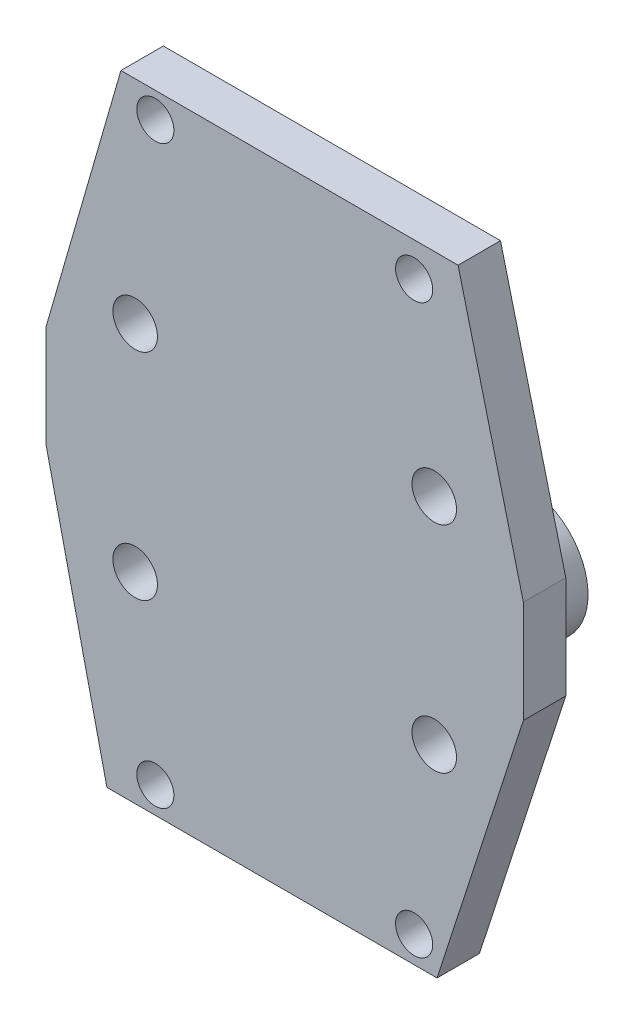
ISO-10303-21;
HEADER;
FILE_DESCRIPTION(('STEP AP214'),'2;1');
FILE_NAME('part.step','',(''),(''),'','','');
FILE_SCHEMA(('AUTOMOTIVE_DESIGN { 1 0 10303 214 1 1 1 1 }'));
ENDSEC;
DATA;
#1=APPLICATION_CONTEXT('core data for automotive mechanical design processes');
#2=APPLICATION_PROTOCOL_DEFINITION('international standard','automotive_design',2000,#1);
#3=PRODUCT_CONTEXT('',#1,'mechanical');
#4=PRODUCT('Part','Part','',(#3));
#5=PRODUCT_RELATED_PRODUCT_CATEGORY('part','',(#4));
#6=PRODUCT_DEFINITION_FORMATION('','',#4);
#7=PRODUCT_DEFINITION_CONTEXT('part definition',#1,'design');
#8=PRODUCT_DEFINITION('design','',#6,#7);
#9=PRODUCT_DEFINITION_SHAPE('','',#8);
#10=(LENGTH_UNIT() NAMED_UNIT(*) SI_UNIT(.MILLI.,.METRE.));
#11=(NAMED_UNIT(*) PLANE_ANGLE_UNIT() SI_UNIT($,.RADIAN.));
#12=(NAMED_UNIT(*) SI_UNIT($,.STERADIAN.) SOLID_ANGLE_UNIT());
#13=UNCERTAINTY_MEASURE_WITH_UNIT(LENGTH_MEASURE(1.E-05),#10,'distance_accuracy_value','');
#14=(GEOMETRIC_REPRESENTATION_CONTEXT(3) GLOBAL_UNCERTAINTY_ASSIGNED_CONTEXT((#13)) GLOBAL_UNIT_ASSIGNED_CONTEXT((#10,
#11,#12)) REPRESENTATION_CONTEXT('',''));
#15=CARTESIAN_POINT('',(0.,0.,0.));
#16=DIRECTION('',(0.,0.,1.));
#17=DIRECTION('',(1.,0.,0.));
#18=AXIS2_PLACEMENT_3D('',#15,#16,#17);
#19=CARTESIAN_POINT('',(0.,0.,0.));
#20=DIRECTION('',(0.,0.,-1.));
#21=DIRECTION('',(-1.,0.,0.));
#22=AXIS2_PLACEMENT_3D('',#19,#20,#21);
#23=PLANE('',#22);
#24=CARTESIAN_POINT('',(25.0999999999999,16.9252777339742,0.));
#25=DIRECTION('',(0.,0.,-1.));
#26=DIRECTION('',(-1.,0.,0.));
#27=AXIS2_PLACEMENT_3D('',#24,#25,#26);
#28=CIRCLE('',#27,2.1);
#29=CARTESIAN_POINT('',(22.9999999999999,16.9252777339742,0.));
#30=VERTEX_POINT('',#29);
#31=EDGE_CURVE('E290',#30,#30,#28,.T.);
#32=ORIENTED_EDGE('',*,*,#31,.F.);
#33=EDGE_LOOP('',(#32));
#34=FACE_BOUND('',#33,.T.);
#35=CARTESIAN_POINT('',(-3.1,37.1947892741322,0.));
#36=DIRECTION('',(0.,0.,-1.));
#37=DIRECTION('',(-1.,0.,0.));
#38=AXIS2_PLACEMENT_3D('',#35,#36,#37);
#39=CIRCLE('',#38,2.1);
#40=CARTESIAN_POINT('',(-5.2,37.1947892741322,0.));
#41=VERTEX_POINT('',#40);
#42=EDGE_CURVE('E294',#41,#41,#39,.T.);
#43=ORIENTED_EDGE('',*,*,#42,.F.);
#44=EDGE_LOOP('',(#43));
#45=FACE_BOUND('',#44,.T.);
#46=CARTESIAN_POINT('',(-3.10000000000006,16.9252777339742,0.));
#47=DIRECTION('',(0.,0.,-1.));
#48=DIRECTION('',(-1.,0.,0.));
#49=AXIS2_PLACEMENT_3D('',#46,#47,#48);
#50=CIRCLE('',#49,2.1);
#51=CARTESIAN_POINT('',(-5.20000000000006,16.9252777339742,0.));
#52=VERTEX_POINT('',#51);
#53=EDGE_CURVE('E298',#52,#52,#50,.T.);
#54=ORIENTED_EDGE('',*,*,#53,.F.);
#55=EDGE_LOOP('',(#54));
#56=FACE_BOUND('',#55,.T.);
#57=CARTESIAN_POINT('',(25.1,37.1947892741322,0.));
#58=DIRECTION('',(0.,0.,-1.));
#59=DIRECTION('',(-1.,0.,0.));
#60=AXIS2_PLACEMENT_3D('',#57,#58,#59);
#61=CIRCLE('',#60,2.1);
#62=CARTESIAN_POINT('',(23.,37.1947892741322,0.));
#63=VERTEX_POINT('',#62);
#64=EDGE_CURVE('E257',#63,#63,#61,.T.);
#65=ORIENTED_EDGE('',*,*,#64,.F.);
#66=EDGE_LOOP('',(#65));
#67=FACE_BOUND('',#66,.T.);
#68=DIRECTION('',(-0.277274916597774,-0.960790622677853,0.));
#69=VECTOR('',#68,1.);
#70=CARTESIAN_POINT('',(-4.44566090426302,57.2,0.));
#71=LINE('',#70,#69);
#72=CARTESIAN_POINT('',(-4.44566090426302,57.2,0.));
#73=VERTEX_POINT('',#72);
#74=CARTESIAN_POINT('',(-11.5,32.7558745250444,0.));
#75=VERTEX_POINT('',#74);
#76=EDGE_CURVE('E172',#73,#75,#71,.T.);
#77=ORIENTED_EDGE('',*,*,#76,.F.);
#78=DIRECTION('',(-1.,0.,0.));
#79=VECTOR('',#78,1.);
#80=CARTESIAN_POINT('',(4.95,57.2,0.));
#81=LINE('',#80,#79);
#82=CARTESIAN_POINT('',(27.3454525684021,57.2,0.));
#83=VERTEX_POINT('',#82);
#84=EDGE_CURVE('E241',#83,#73,#81,.T.);
#85=ORIENTED_EDGE('',*,*,#84,.F.);
#86=DIRECTION('',(-0.244160082212127,0.969734940204883,0.));
#87=VECTOR('',#86,1.);
#88=CARTESIAN_POINT('',(27.3454525684021,57.2,0.));
#89=LINE('',#88,#87);
#90=CARTESIAN_POINT('',(33.5,32.7558745250443,0.));
#91=VERTEX_POINT('',#90);
#92=EDGE_CURVE('E177',#91,#83,#89,.T.);
#93=ORIENTED_EDGE('',*,*,#92,.F.);
#94=DIRECTION('',(0.,1.,0.));
#95=VECTOR('',#94,1.);
#96=CARTESIAN_POINT('',(33.5,-2.,0.));
#97=LINE('',#96,#95);
#98=CARTESIAN_POINT('',(33.5,23.0946790021825,0.));
#99=VERTEX_POINT('',#98);
#100=EDGE_CURVE('E220',#99,#91,#97,.T.);
#101=ORIENTED_EDGE('',*,*,#100,.F.);
#102=DIRECTION('',(0.308419509687572,0.95125044338706,0.));
#103=VECTOR('',#102,1.);
#104=CARTESIAN_POINT('',(25.3636688714048,-2.,0.));
#105=LINE('',#104,#103);
#106=CARTESIAN_POINT('',(25.3636688714048,-2.,0.));
#107=VERTEX_POINT('',#106);
#108=EDGE_CURVE('E171',#107,#99,#105,.T.);
#109=ORIENTED_EDGE('',*,*,#108,.F.);
#110=DIRECTION('',(1.,0.,0.));
#111=VECTOR('',#110,1.);
#112=CARTESIAN_POINT('',(17.05,-2.,0.));
#113=LINE('',#112,#111);
#114=CARTESIAN_POINT('',(-5.76685003559456,-2.,0.));
#115=VERTEX_POINT('',#114);
#116=EDGE_CURVE('E235',#115,#107,#113,.T.);
#117=ORIENTED_EDGE('',*,*,#116,.F.);
#118=DIRECTION('',(0.222722287733107,-0.974881932618987,0.));
#119=VECTOR('',#118,1.);
#120=CARTESIAN_POINT('',(-11.5,23.0946790021825,0.));
#121=LINE('',#120,#119);
#122=CARTESIAN_POINT('',(-11.5,23.0946790021825,0.));
#123=VERTEX_POINT('',#122);
#124=EDGE_CURVE('E166',#123,#115,#121,.T.);
#125=ORIENTED_EDGE('',*,*,#124,.F.);
#126=DIRECTION('',(0.,-1.,0.));
#127=VECTOR('',#126,1.);
#128=CARTESIAN_POINT('',(-11.5,57.2,0.));
#129=LINE('',#128,#127);
#130=EDGE_CURVE('E226',#75,#123,#129,.T.);
#131=ORIENTED_EDGE('',*,*,#130,.F.);
#132=EDGE_LOOP('',(#77,#85,#93,#101,#109,#117,#125,#131));
#133=FACE_BOUND('',#132,.T.);
#134=CARTESIAN_POINT('',(23.2,0.5,0.));
#135=DIRECTION('',(0.,0.,-1.));
#136=DIRECTION('',(-1.,0.,0.));
#137=AXIS2_PLACEMENT_3D('',#134,#135,#136);
#138=CIRCLE('',#137,1.75);
#139=CARTESIAN_POINT('',(21.45,0.5,0.));
#140=VERTEX_POINT('',#139);
#141=EDGE_CURVE('E196',#140,#140,#138,.T.);
#142=ORIENTED_EDGE('',*,*,#141,.F.);
#143=EDGE_LOOP('',(#142));
#144=FACE_BOUND('',#143,.T.);
#145=CARTESIAN_POINT('',(-1.2,0.5,0.));
#146=DIRECTION('',(0.,0.,-1.));
#147=DIRECTION('',(-1.,0.,0.));
#148=AXIS2_PLACEMENT_3D('',#145,#146,#147);
#149=CIRCLE('',#148,1.75);
#150=CARTESIAN_POINT('',(-2.95,0.5,0.));
#151=VERTEX_POINT('',#150);
#152=EDGE_CURVE('E201',#151,#151,#149,.T.);
#153=ORIENTED_EDGE('',*,*,#152,.F.);
#154=EDGE_LOOP('',(#153));
#155=FACE_BOUND('',#154,.T.);
#156=CARTESIAN_POINT('',(-1.2,54.8,0.));
#157=DIRECTION('',(0.,0.,-1.));
#158=DIRECTION('',(-1.,0.,0.));
#159=AXIS2_PLACEMENT_3D('',#156,#157,#158);
#160=CIRCLE('',#159,1.75);
#161=CARTESIAN_POINT('',(-2.95,54.8,0.));
#162=VERTEX_POINT('',#161);
#163=EDGE_CURVE('E197',#162,#162,#160,.T.);
#164=ORIENTED_EDGE('',*,*,#163,.F.);
#165=EDGE_LOOP('',(#164));
#166=FACE_BOUND('',#165,.T.);
#167=CARTESIAN_POINT('',(23.2,54.,0.));
#168=DIRECTION('',(0.,0.,-1.));
#169=DIRECTION('',(-1.,0.,0.));
#170=AXIS2_PLACEMENT_3D('',#167,#168,#169);
#171=CIRCLE('',#170,1.75);
#172=CARTESIAN_POINT('',(21.45,54.,0.));
#173=VERTEX_POINT('',#172);
#174=EDGE_CURVE('E200',#173,#173,#171,.T.);
#175=ORIENTED_EDGE('',*,*,#174,.F.);
#176=EDGE_LOOP('',(#175));
#177=FACE_BOUND('',#176,.T.);
#178=DIRECTION('',(0.,1.,0.));
#179=VECTOR('',#178,1.);
#180=CARTESIAN_POINT('',(21.25,32.5271785443993,0.));
#181=LINE('',#180,#179);
#182=CARTESIAN_POINT('',(21.25,23.3233749828276,0.));
#183=VERTEX_POINT('',#182);
#184=CARTESIAN_POINT('',(21.25,32.5271785443993,0.));
#185=VERTEX_POINT('',#184);
#186=EDGE_CURVE('E162',#183,#185,#181,.T.);
#187=ORIENTED_EDGE('',*,*,#186,.F.);
#188=CARTESIAN_POINT('',(25.1,27.9252767636134,0.));
#189=DIRECTION('',(0.,0.,-1.));
#190=DIRECTION('',(-1.,0.,0.));
#191=AXIS2_PLACEMENT_3D('',#188,#189,#190);
#192=CIRCLE('',#191,6.);
#193=EDGE_CURVE('E160',#185,#183,#192,.T.);
#194=ORIENTED_EDGE('',*,*,#193,.F.);
#195=EDGE_LOOP('',(#187,#194));
#196=FACE_BOUND('',#195,.T.);
#197=DIRECTION('',(0.,-1.,0.));
#198=VECTOR('',#197,1.);
#199=CARTESIAN_POINT('',(1.11298793807284,23.653189143532,0.));
#200=LINE('',#199,#198);
#201=CARTESIAN_POINT('',(1.11298793807284,32.1973643836948,0.));
#202=VERTEX_POINT('',#201);
#203=CARTESIAN_POINT('',(1.11298793807284,23.653189143532,0.));
#204=VERTEX_POINT('',#203);
#205=EDGE_CURVE('E318',#202,#204,#200,.T.);
#206=ORIENTED_EDGE('',*,*,#205,.F.);
#207=CARTESIAN_POINT('',(-3.1,27.9252767636134,0.));
#208=DIRECTION('',(0.,0.,-1.));
#209=DIRECTION('',(-1.,0.,0.));
#210=AXIS2_PLACEMENT_3D('',#207,#208,#209);
#211=CIRCLE('',#210,6.);
#212=EDGE_CURVE('E63',#204,#202,#211,.T.);
#213=ORIENTED_EDGE('',*,*,#212,.F.);
#214=EDGE_LOOP('',(#206,#213));
#215=FACE_BOUND('',#214,.T.);
#216=ADVANCED_FACE('F41',(#34,#45,#56,#67,#133,#144,#155,#166,#177,#196,#215),#23,.T.);
#217=CARTESIAN_POINT('',(0.,0.,4.));
#218=DIRECTION('',(0.,0.,-1.));
#219=DIRECTION('',(-1.,0.,0.));
#220=AXIS2_PLACEMENT_3D('',#217,#218,#219);
#221=PLANE('',#220);
#222=CARTESIAN_POINT('',(25.0999999999999,16.9252777339742,4.));
#223=DIRECTION('',(0.,0.,-1.));
#224=DIRECTION('',(-1.,0.,0.));
#225=AXIS2_PLACEMENT_3D('',#222,#223,#224);
#226=CIRCLE('',#225,2.1);
#227=CARTESIAN_POINT('',(22.9999999999999,16.9252777339742,4.));
#228=VERTEX_POINT('',#227);
#229=EDGE_CURVE('E44',#228,#228,#226,.T.);
#230=ORIENTED_EDGE('',*,*,#229,.T.);
#231=EDGE_LOOP('',(#230));
#232=FACE_BOUND('',#231,.T.);
#233=CARTESIAN_POINT('',(-3.1,37.1947892741322,4.));
#234=DIRECTION('',(0.,0.,-1.));
#235=DIRECTION('',(-1.,0.,0.));
#236=AXIS2_PLACEMENT_3D('',#233,#234,#235);
#237=CIRCLE('',#236,2.1);
#238=CARTESIAN_POINT('',(-5.2,37.1947892741322,4.));
#239=VERTEX_POINT('',#238);
#240=EDGE_CURVE('E259',#239,#239,#237,.T.);
#241=ORIENTED_EDGE('',*,*,#240,.T.);
#242=EDGE_LOOP('',(#241));
#243=FACE_BOUND('',#242,.T.);
#244=CARTESIAN_POINT('',(-3.10000000000006,16.9252777339742,4.));
#245=DIRECTION('',(0.,0.,-1.));
#246=DIRECTION('',(-1.,0.,0.));
#247=AXIS2_PLACEMENT_3D('',#244,#245,#246);
#248=CIRCLE('',#247,2.1);
#249=CARTESIAN_POINT('',(-5.20000000000006,16.9252777339742,4.));
#250=VERTEX_POINT('',#249);
#251=EDGE_CURVE('E256',#250,#250,#248,.T.);
#252=ORIENTED_EDGE('',*,*,#251,.T.);
#253=EDGE_LOOP('',(#252));
#254=FACE_BOUND('',#253,.T.);
#255=CARTESIAN_POINT('',(25.1,37.1947892741322,4.));
#256=DIRECTION('',(0.,0.,-1.));
#257=DIRECTION('',(-1.,0.,0.));
#258=AXIS2_PLACEMENT_3D('',#255,#256,#257);
#259=CIRCLE('',#258,2.1);
#260=CARTESIAN_POINT('',(23.,37.1947892741322,4.));
#261=VERTEX_POINT('',#260);
#262=EDGE_CURVE('E253',#261,#261,#259,.T.);
#263=ORIENTED_EDGE('',*,*,#262,.T.);
#264=EDGE_LOOP('',(#263));
#265=FACE_BOUND('',#264,.T.);
#266=CARTESIAN_POINT('',(23.2,0.5,4.));
#267=DIRECTION('',(0.,0.,-1.));
#268=DIRECTION('',(-1.,0.,0.));
#269=AXIS2_PLACEMENT_3D('',#266,#267,#268);
#270=CIRCLE('',#269,1.75);
#271=CARTESIAN_POINT('',(21.45,0.5,4.));
#272=VERTEX_POINT('',#271);
#273=EDGE_CURVE('E217',#272,#272,#270,.T.);
#274=ORIENTED_EDGE('',*,*,#273,.T.);
#275=EDGE_LOOP('',(#274));
#276=FACE_BOUND('',#275,.T.);
#277=CARTESIAN_POINT('',(-1.2,0.5,4.));
#278=DIRECTION('',(0.,0.,-1.));
#279=DIRECTION('',(-1.,0.,0.));
#280=AXIS2_PLACEMENT_3D('',#277,#278,#279);
#281=CIRCLE('',#280,1.75);
#282=CARTESIAN_POINT('',(-2.95,0.5,4.));
#283=VERTEX_POINT('',#282);
#284=EDGE_CURVE('E214',#283,#283,#281,.T.);
#285=ORIENTED_EDGE('',*,*,#284,.T.);
#286=EDGE_LOOP('',(#285));
#287=FACE_BOUND('',#286,.T.);
#288=CARTESIAN_POINT('',(-1.2,54.8,4.));
#289=DIRECTION('',(0.,0.,-1.));
#290=DIRECTION('',(-1.,0.,0.));
#291=AXIS2_PLACEMENT_3D('',#288,#289,#290);
#292=CIRCLE('',#291,1.75);
#293=CARTESIAN_POINT('',(-2.95,54.8,4.));
#294=VERTEX_POINT('',#293);
#295=EDGE_CURVE('E211',#294,#294,#292,.T.);
#296=ORIENTED_EDGE('',*,*,#295,.T.);
#297=EDGE_LOOP('',(#296));
#298=FACE_BOUND('',#297,.T.);
#299=CARTESIAN_POINT('',(23.2,54.,4.));
#300=DIRECTION('',(0.,0.,-1.));
#301=DIRECTION('',(-1.,0.,0.));
#302=AXIS2_PLACEMENT_3D('',#299,#300,#301);
#303=CIRCLE('',#302,1.75);
#304=CARTESIAN_POINT('',(21.45,54.,4.));
#305=VERTEX_POINT('',#304);
#306=EDGE_CURVE('E208',#305,#305,#303,.T.);
#307=ORIENTED_EDGE('',*,*,#306,.T.);
#308=EDGE_LOOP('',(#307));
#309=FACE_BOUND('',#308,.T.);
#310=DIRECTION('',(1.,0.,0.));
#311=VECTOR('',#310,1.);
#312=CARTESIAN_POINT('',(0.,57.2,4.));
#313=LINE('',#312,#311);
#314=CARTESIAN_POINT('',(-4.44566090426302,57.2,4.));
#315=VERTEX_POINT('',#314);
#316=CARTESIAN_POINT('',(27.3454525684021,57.2,4.));
#317=VERTEX_POINT('',#316);
#318=EDGE_CURVE('E238',#315,#317,#313,.T.);
#319=ORIENTED_EDGE('',*,*,#318,.F.);
#320=DIRECTION('',(-0.277274916597774,-0.960790622677853,0.));
#321=VECTOR('',#320,1.);
#322=CARTESIAN_POINT('',(-19.3421319566098,5.58195292346264,4.));
#323=LINE('',#322,#321);
#324=CARTESIAN_POINT('',(-11.5,32.7558745250443,4.));
#325=VERTEX_POINT('',#324);
#326=EDGE_CURVE('E193',#315,#325,#323,.T.);
#327=ORIENTED_EDGE('',*,*,#326,.T.);
#328=DIRECTION('',(0.,1.,0.));
#329=VECTOR('',#328,1.);
#330=CARTESIAN_POINT('',(-11.5,-2.,4.));
#331=LINE('',#330,#329);
#332=CARTESIAN_POINT('',(-11.5,23.0946790021825,4.));
#333=VERTEX_POINT('',#332);
#334=EDGE_CURVE('E229',#333,#325,#331,.T.);
#335=ORIENTED_EDGE('',*,*,#334,.F.);
#336=DIRECTION('',(0.222722287733107,-0.974881932618987,0.));
#337=VECTOR('',#336,1.);
#338=CARTESIAN_POINT('',(-5.9150400541648,-1.35135467056751,4.));
#339=LINE('',#338,#337);
#340=CARTESIAN_POINT('',(-5.76685003559456,-2.,4.));
#341=VERTEX_POINT('',#340);
#342=EDGE_CURVE('E190',#333,#341,#339,.T.);
#343=ORIENTED_EDGE('',*,*,#342,.T.);
#344=DIRECTION('',(-1.,0.,0.));
#345=VECTOR('',#344,1.);
#346=CARTESIAN_POINT('',(22.,-2.,4.));
#347=LINE('',#346,#345);
#348=CARTESIAN_POINT('',(25.3636688714048,-2.,4.));
#349=VERTEX_POINT('',#348);
#350=EDGE_CURVE('E232',#349,#341,#347,.T.);
#351=ORIENTED_EDGE('',*,*,#350,.F.);
#352=DIRECTION('',(0.308419509687572,0.95125044338706,0.));
#353=VECTOR('',#352,1.);
#354=CARTESIAN_POINT('',(23.5377792867967,-7.63154477060704,4.));
#355=LINE('',#354,#353);
#356=CARTESIAN_POINT('',(33.5,23.0946790021825,4.));
#357=VERTEX_POINT('',#356);
#358=EDGE_CURVE('E187',#349,#357,#355,.T.);
#359=ORIENTED_EDGE('',*,*,#358,.T.);
#360=DIRECTION('',(0.,-1.,0.));
#361=VECTOR('',#360,1.);
#362=CARTESIAN_POINT('',(33.5,57.2,4.));
#363=LINE('',#362,#361);
#364=CARTESIAN_POINT('',(33.5,32.7558745250443,4.));
#365=VERTEX_POINT('',#364);
#366=EDGE_CURVE('E223',#365,#357,#363,.T.);
#367=ORIENTED_EDGE('',*,*,#366,.F.);
#368=DIRECTION('',(-0.244160082212127,0.969734940204883,0.));
#369=VECTOR('',#368,1.);
#370=CARTESIAN_POINT('',(39.2585529613391,9.88452732923545,4.));
#371=LINE('',#370,#369);
#372=EDGE_CURVE('E184',#365,#317,#371,.T.);
#373=ORIENTED_EDGE('',*,*,#372,.T.);
#374=EDGE_LOOP('',(#319,#327,#335,#343,#351,#359,#367,#373));
#375=FACE_BOUND('',#374,.T.);
#376=ADVANCED_FACE('F266',(#232,#243,#254,#265,#276,#287,#298,#309,#375),#221,.F.);
#377=CARTESIAN_POINT('',(0.,57.2,0.));
#378=DIRECTION('',(0.,1.,0.));
#379=DIRECTION('',(0.,0.,1.));
#380=AXIS2_PLACEMENT_3D('',#377,#378,#379);
#381=PLANE('',#380);
#382=DIRECTION('',(0.,0.,-1.));
#383=VECTOR('',#382,1.);
#384=CARTESIAN_POINT('',(-4.44566090426302,57.2,10.));
#385=LINE('',#384,#383);
#386=EDGE_CURVE('E174',#315,#73,#385,.T.);
#387=ORIENTED_EDGE('',*,*,#386,.F.);
#388=ORIENTED_EDGE('',*,*,#318,.T.);
#389=DIRECTION('',(0.,0.,-1.));
#390=VECTOR('',#389,1.);
#391=CARTESIAN_POINT('',(27.3454525684021,57.2,10.));
#392=LINE('',#391,#390);
#393=EDGE_CURVE('E181',#317,#83,#392,.T.);
#394=ORIENTED_EDGE('',*,*,#393,.T.);
#395=ORIENTED_EDGE('',*,*,#84,.T.);
#396=EDGE_LOOP('',(#387,#388,#394,#395));
#397=FACE_BOUND('',#396,.T.);
#398=ADVANCED_FACE('F287',(#397),#381,.T.);
#399=CARTESIAN_POINT('',(0.,-2.,0.));
#400=DIRECTION('',(0.,-1.,0.));
#401=DIRECTION('',(0.,0.,-1.));
#402=AXIS2_PLACEMENT_3D('',#399,#400,#401);
#403=PLANE('',#402);
#404=DIRECTION('',(0.,0.,-1.));
#405=VECTOR('',#404,1.);
#406=CARTESIAN_POINT('',(25.3636688714048,-2.,10.));
#407=LINE('',#406,#405);
#408=EDGE_CURVE('E175',#349,#107,#407,.T.);
#409=ORIENTED_EDGE('',*,*,#408,.F.);
#410=ORIENTED_EDGE('',*,*,#350,.T.);
#411=DIRECTION('',(0.,0.,-1.));
#412=VECTOR('',#411,1.);
#413=CARTESIAN_POINT('',(-5.76685003559456,-2.,10.));
#414=LINE('',#413,#412);
#415=EDGE_CURVE('E168',#341,#115,#414,.T.);
#416=ORIENTED_EDGE('',*,*,#415,.T.);
#417=ORIENTED_EDGE('',*,*,#116,.T.);
#418=EDGE_LOOP('',(#409,#410,#416,#417));
#419=FACE_BOUND('',#418,.T.);
#420=ADVANCED_FACE('F374',(#419),#403,.T.);
#421=CARTESIAN_POINT('',(-11.5,0.,0.));
#422=DIRECTION('',(-1.,0.,0.));
#423=DIRECTION('',(0.,0.,1.));
#424=AXIS2_PLACEMENT_3D('',#421,#422,#423);
#425=PLANE('',#424);
#426=DIRECTION('',(0.,0.,1.));
#427=VECTOR('',#426,1.);
#428=CARTESIAN_POINT('',(-11.5,32.7558745250443,0.));
#429=LINE('',#428,#427);
#430=EDGE_CURVE('E49',#75,#325,#429,.T.);
#431=ORIENTED_EDGE('',*,*,#430,.F.);
#432=ORIENTED_EDGE('',*,*,#130,.T.);
#433=DIRECTION('',(0.,0.,-1.));
#434=VECTOR('',#433,1.);
#435=CARTESIAN_POINT('',(-11.5,23.0946790021825,0.));
#436=LINE('',#435,#434);
#437=EDGE_CURVE('E248',#333,#123,#436,.T.);
#438=ORIENTED_EDGE('',*,*,#437,.F.);
#439=ORIENTED_EDGE('',*,*,#334,.T.);
#440=EDGE_LOOP('',(#431,#432,#438,#439));
#441=FACE_BOUND('',#440,.T.);
#442=ADVANCED_FACE('F365',(#441),#425,.T.);
#443=CARTESIAN_POINT('',(33.5,0.,0.));
#444=DIRECTION('',(1.,0.,0.));
#445=DIRECTION('',(0.,0.,-1.));
#446=AXIS2_PLACEMENT_3D('',#443,#444,#445);
#447=PLANE('',#446);
#448=DIRECTION('',(0.,0.,1.));
#449=VECTOR('',#448,1.);
#450=CARTESIAN_POINT('',(33.5,23.0946790021825,0.));
#451=LINE('',#450,#449);
#452=EDGE_CURVE('E246',#99,#357,#451,.T.);
#453=ORIENTED_EDGE('',*,*,#452,.F.);
#454=ORIENTED_EDGE('',*,*,#100,.T.);
#455=DIRECTION('',(0.,0.,-1.));
#456=VECTOR('',#455,1.);
#457=CARTESIAN_POINT('',(33.5,32.7558745250443,0.));
#458=LINE('',#457,#456);
#459=EDGE_CURVE('E244',#365,#91,#458,.T.);
#460=ORIENTED_EDGE('',*,*,#459,.F.);
#461=ORIENTED_EDGE('',*,*,#366,.T.);
#462=EDGE_LOOP('',(#453,#454,#460,#461));
#463=FACE_BOUND('',#462,.T.);
#464=ADVANCED_FACE('F380',(#463),#447,.T.);
#465=CARTESIAN_POINT('',(23.2,54.,11.5));
#466=DIRECTION('',(0.,0.,-1.));
#467=DIRECTION('',(-1.,0.,0.));
#468=AXIS2_PLACEMENT_3D('',#465,#466,#467);
#469=CYLINDRICAL_SURFACE('',#468,1.75);
#470=ORIENTED_EDGE('',*,*,#174,.T.);
#471=EDGE_LOOP('',(#470));
#472=FACE_BOUND('',#471,.T.);
#473=ORIENTED_EDGE('',*,*,#306,.F.);
#474=EDGE_LOOP('',(#473));
#475=FACE_BOUND('',#474,.T.);
#476=ADVANCED_FACE('F401',(#472,#475),#469,.F.);
#477=CARTESIAN_POINT('',(-1.2,54.8,11.5));
#478=DIRECTION('',(0.,0.,-1.));
#479=DIRECTION('',(-1.,0.,0.));
#480=AXIS2_PLACEMENT_3D('',#477,#478,#479);
#481=CYLINDRICAL_SURFACE('',#480,1.75);
#482=ORIENTED_EDGE('',*,*,#163,.T.);
#483=EDGE_LOOP('',(#482));
#484=FACE_BOUND('',#483,.T.);
#485=ORIENTED_EDGE('',*,*,#295,.F.);
#486=EDGE_LOOP('',(#485));
#487=FACE_BOUND('',#486,.T.);
#488=ADVANCED_FACE('F397',(#484,#487),#481,.F.);
#489=CARTESIAN_POINT('',(-1.2,0.5,11.5));
#490=DIRECTION('',(0.,0.,-1.));
#491=DIRECTION('',(-1.,0.,0.));
#492=AXIS2_PLACEMENT_3D('',#489,#490,#491);
#493=CYLINDRICAL_SURFACE('',#492,1.75);
#494=ORIENTED_EDGE('',*,*,#152,.T.);
#495=EDGE_LOOP('',(#494));
#496=FACE_BOUND('',#495,.T.);
#497=ORIENTED_EDGE('',*,*,#284,.F.);
#498=EDGE_LOOP('',(#497));
#499=FACE_BOUND('',#498,.T.);
#500=ADVANCED_FACE('F400',(#496,#499),#493,.F.);
#501=CARTESIAN_POINT('',(23.2,0.5,11.5));
#502=DIRECTION('',(0.,0.,-1.));
#503=DIRECTION('',(-1.,0.,0.));
#504=AXIS2_PLACEMENT_3D('',#501,#502,#503);
#505=CYLINDRICAL_SURFACE('',#504,1.75);
#506=ORIENTED_EDGE('',*,*,#141,.T.);
#507=EDGE_LOOP('',(#506));
#508=FACE_BOUND('',#507,.T.);
#509=ORIENTED_EDGE('',*,*,#273,.F.);
#510=EDGE_LOOP('',(#509));
#511=FACE_BOUND('',#510,.T.);
#512=ADVANCED_FACE('F393',(#508,#511),#505,.F.);
#513=CARTESIAN_POINT('',(27.3454525684021,57.2,10.));
#514=DIRECTION('',(-0.969734940204883,-0.244160082212127,0.));
#515=DIRECTION('',(0.244160082212127,-0.969734940204883,0.));
#516=AXIS2_PLACEMENT_3D('',#513,#514,#515);
#517=PLANE('',#516);
#518=ORIENTED_EDGE('',*,*,#459,.T.);
#519=ORIENTED_EDGE('',*,*,#92,.T.);
#520=ORIENTED_EDGE('',*,*,#393,.F.);
#521=ORIENTED_EDGE('',*,*,#372,.F.);
#522=EDGE_LOOP('',(#518,#519,#520,#521));
#523=FACE_BOUND('',#522,.T.);
#524=ADVANCED_FACE('F384',(#523),#517,.F.);
#525=CARTESIAN_POINT('',(25.3636688714048,-2.,10.));
#526=DIRECTION('',(-0.95125044338706,0.308419509687572,0.));
#527=DIRECTION('',(-0.308419509687572,-0.95125044338706,0.));
#528=AXIS2_PLACEMENT_3D('',#525,#526,#527);
#529=PLANE('',#528);
#530=ORIENTED_EDGE('',*,*,#408,.T.);
#531=ORIENTED_EDGE('',*,*,#108,.T.);
#532=ORIENTED_EDGE('',*,*,#452,.T.);
#533=ORIENTED_EDGE('',*,*,#358,.F.);
#534=EDGE_LOOP('',(#530,#531,#532,#533));
#535=FACE_BOUND('',#534,.T.);
#536=ADVANCED_FACE('F385',(#535),#529,.F.);
#537=CARTESIAN_POINT('',(-11.5,23.0946790021825,10.));
#538=DIRECTION('',(0.974881932618987,0.222722287733107,0.));
#539=DIRECTION('',(-0.222722287733107,0.974881932618987,0.));
#540=AXIS2_PLACEMENT_3D('',#537,#538,#539);
#541=PLANE('',#540);
#542=ORIENTED_EDGE('',*,*,#437,.T.);
#543=ORIENTED_EDGE('',*,*,#124,.T.);
#544=ORIENTED_EDGE('',*,*,#415,.F.);
#545=ORIENTED_EDGE('',*,*,#342,.F.);
#546=EDGE_LOOP('',(#542,#543,#544,#545));
#547=FACE_BOUND('',#546,.T.);
#548=ADVANCED_FACE('F371',(#547),#541,.F.);
#549=CARTESIAN_POINT('',(-4.44566090426302,57.2,10.));
#550=DIRECTION('',(0.960790622677853,-0.277274916597774,0.));
#551=DIRECTION('',(0.277274916597774,0.960790622677853,0.));
#552=AXIS2_PLACEMENT_3D('',#549,#550,#551);
#553=PLANE('',#552);
#554=ORIENTED_EDGE('',*,*,#386,.T.);
#555=ORIENTED_EDGE('',*,*,#76,.T.);
#556=ORIENTED_EDGE('',*,*,#430,.T.);
#557=ORIENTED_EDGE('',*,*,#326,.F.);
#558=EDGE_LOOP('',(#554,#555,#556,#557));
#559=FACE_BOUND('',#558,.T.);
#560=ADVANCED_FACE('F362',(#559),#553,.F.);
#561=CARTESIAN_POINT('',(25.1,27.9252767636134,-4.5));
#562=DIRECTION('',(0.,0.,1.));
#563=DIRECTION('',(1.,0.,0.));
#564=AXIS2_PLACEMENT_3D('',#561,#562,#563);
#565=CYLINDRICAL_SURFACE('',#564,6.);
#566=ORIENTED_EDGE('',*,*,#193,.T.);
#567=DIRECTION('',(0.,0.,1.));
#568=VECTOR('',#567,1.);
#569=CARTESIAN_POINT('',(21.25,23.3233749828276,-4.5));
#570=LINE('',#569,#568);
#571=CARTESIAN_POINT('',(21.25,23.3233749828276,-4.5));
#572=VERTEX_POINT('',#571);
#573=EDGE_CURVE('E155',#572,#183,#570,.T.);
#574=ORIENTED_EDGE('',*,*,#573,.F.);
#575=CARTESIAN_POINT('',(25.1,27.9252767636134,-4.5));
#576=DIRECTION('',(0.,0.,-1.));
#577=DIRECTION('',(-1.,0.,0.));
#578=AXIS2_PLACEMENT_3D('',#575,#576,#577);
#579=CIRCLE('',#578,6.);
#580=CARTESIAN_POINT('',(21.25,32.5271785443993,-4.5));
#581=VERTEX_POINT('',#580);
#582=EDGE_CURVE('E150',#581,#572,#579,.T.);
#583=ORIENTED_EDGE('',*,*,#582,.F.);
#584=DIRECTION('',(0.,0.,1.));
#585=VECTOR('',#584,1.);
#586=CARTESIAN_POINT('',(21.25,32.5271785443993,-4.5));
#587=LINE('',#586,#585);
#588=EDGE_CURVE('E152',#581,#185,#587,.T.);
#589=ORIENTED_EDGE('',*,*,#588,.T.);
#590=EDGE_LOOP('',(#566,#574,#583,#589));
#591=FACE_BOUND('',#590,.T.);
#592=ADVANCED_FACE('F475',(#591),#565,.T.);
#593=CARTESIAN_POINT('',(21.25,32.5271785443993,-4.5));
#594=DIRECTION('',(1.,0.,0.));
#595=DIRECTION('',(0.,0.,-1.));
#596=AXIS2_PLACEMENT_3D('',#593,#594,#595);
#597=PLANE('',#596);
#598=CARTESIAN_POINT('',(21.25,27.9252767636134,-7.5));
#599=DIRECTION('',(1.,0.,0.));
#600=DIRECTION('',(0.,0.,-1.));
#601=AXIS2_PLACEMENT_3D('',#598,#599,#600);
#602=CIRCLE('',#601,3.19021942818986);
#603=CARTESIAN_POINT('',(21.25,26.8401500429029,-4.5));
#604=VERTEX_POINT('',#603);
#605=CARTESIAN_POINT('',(21.25,29.0104034843239,-4.5));
#606=VERTEX_POINT('',#605);
#607=EDGE_CURVE('E56',#604,#606,#602,.F.);
#608=ORIENTED_EDGE('',*,*,#607,.F.);
#609=DIRECTION('',(0.,1.,0.));
#610=VECTOR('',#609,1.);
#611=CARTESIAN_POINT('',(21.25,32.5271785443993,-4.5));
#612=LINE('',#611,#610);
#613=EDGE_CURVE('E142',#572,#604,#612,.T.);
#614=ORIENTED_EDGE('',*,*,#613,.F.);
#615=ORIENTED_EDGE('',*,*,#573,.T.);
#616=ORIENTED_EDGE('',*,*,#186,.T.);
#617=ORIENTED_EDGE('',*,*,#588,.F.);
#618=EDGE_CURVE('E145',#606,#581,#612,.T.);
#619=ORIENTED_EDGE('',*,*,#618,.F.);
#620=EDGE_LOOP('',(#608,#614,#615,#616,#617,#619));
#621=FACE_BOUND('',#620,.T.);
#622=ADVANCED_FACE('F140',(#621),#597,.F.);
#623=CARTESIAN_POINT('',(25.1,27.9252767636134,-4.5));
#624=DIRECTION('',(0.,0.,-1.));
#625=DIRECTION('',(-1.,0.,0.));
#626=AXIS2_PLACEMENT_3D('',#623,#624,#625);
#627=PLANE('',#626);
#628=ORIENTED_EDGE('',*,*,#613,.T.);
#629=CARTESIAN_POINT('',(25.1,27.9252767636134,-4.5));
#630=DIRECTION('',(0.,0.,-1.));
#631=DIRECTION('',(-1.,0.,0.));
#632=AXIS2_PLACEMENT_3D('',#629,#630,#631);
#633=CIRCLE('',#632,4.);
#634=EDGE_CURVE('E11',#604,#606,#633,.F.);
#635=ORIENTED_EDGE('',*,*,#634,.T.);
#636=ORIENTED_EDGE('',*,*,#618,.T.);
#637=ORIENTED_EDGE('',*,*,#582,.T.);
#638=EDGE_LOOP('',(#628,#635,#636,#637));
#639=FACE_BOUND('',#638,.T.);
#640=ADVANCED_FACE('F148',(#639),#627,.T.);
#641=CARTESIAN_POINT('',(-3.1,27.9252767636134,-4.5));
#642=DIRECTION('',(0.,0.,1.));
#643=DIRECTION('',(1.,0.,0.));
#644=AXIS2_PLACEMENT_3D('',#641,#642,#643);
#645=CYLINDRICAL_SURFACE('',#644,6.);
#646=ORIENTED_EDGE('',*,*,#212,.T.);
#647=DIRECTION('',(0.,0.,1.));
#648=VECTOR('',#647,1.);
#649=CARTESIAN_POINT('',(1.11298793807284,32.1973643836948,-4.5));
#650=LINE('',#649,#648);
#651=CARTESIAN_POINT('',(1.11298793807284,32.1973643836948,-4.5));
#652=VERTEX_POINT('',#651);
#653=EDGE_CURVE('E163',#652,#202,#650,.T.);
#654=ORIENTED_EDGE('',*,*,#653,.F.);
#655=CARTESIAN_POINT('',(-3.1,27.9252767636134,-4.5));
#656=DIRECTION('',(0.,0.,-1.));
#657=DIRECTION('',(-1.,0.,0.));
#658=AXIS2_PLACEMENT_3D('',#655,#656,#657);
#659=CIRCLE('',#658,6.);
#660=CARTESIAN_POINT('',(1.11298793807284,23.653189143532,-4.5));
#661=VERTEX_POINT('',#660);
#662=EDGE_CURVE('E321',#661,#652,#659,.T.);
#663=ORIENTED_EDGE('',*,*,#662,.F.);
#664=DIRECTION('',(0.,0.,1.));
#665=VECTOR('',#664,1.);
#666=CARTESIAN_POINT('',(1.11298793807284,23.653189143532,-4.5));
#667=LINE('',#666,#665);
#668=EDGE_CURVE('E329',#661,#204,#667,.T.);
#669=ORIENTED_EDGE('',*,*,#668,.T.);
#670=EDGE_LOOP('',(#646,#654,#663,#669));
#671=FACE_BOUND('',#670,.T.);
#672=ADVANCED_FACE('F332',(#671),#645,.T.);
#673=CARTESIAN_POINT('',(1.11298793807284,23.653189143532,-4.5));
#674=DIRECTION('',(-1.,0.,0.));
#675=DIRECTION('',(0.,0.,1.));
#676=AXIS2_PLACEMENT_3D('',#673,#674,#675);
#677=PLANE('',#676);
#678=ORIENTED_EDGE('',*,*,#205,.T.);
#679=ORIENTED_EDGE('',*,*,#668,.F.);
#680=DIRECTION('',(0.,-1.,0.));
#681=VECTOR('',#680,1.);
#682=CARTESIAN_POINT('',(1.11298793807284,23.653189143532,-4.5));
#683=LINE('',#682,#681);
#684=EDGE_CURVE('E324',#652,#661,#683,.T.);
#685=ORIENTED_EDGE('',*,*,#684,.F.);
#686=ORIENTED_EDGE('',*,*,#653,.T.);
#687=EDGE_LOOP('',(#678,#679,#685,#686));
#688=FACE_BOUND('',#687,.T.);
#689=ADVANCED_FACE('F330',(#688),#677,.F.);
#690=CARTESIAN_POINT('',(-3.1,27.9252767636134,-4.5));
#691=DIRECTION('',(0.,0.,-1.));
#692=DIRECTION('',(-1.,0.,0.));
#693=AXIS2_PLACEMENT_3D('',#690,#691,#692);
#694=PLANE('',#693);
#695=CARTESIAN_POINT('',(-3.1,27.9252767636134,-4.5));
#696=DIRECTION('',(0.,0.,-1.));
#697=DIRECTION('',(-1.,0.,0.));
#698=AXIS2_PLACEMENT_3D('',#695,#696,#697);
#699=CIRCLE('',#698,4.00000000000001);
#700=CARTESIAN_POINT('',(-7.1,27.9252767636134,-4.5));
#701=VERTEX_POINT('',#700);
#702=EDGE_CURVE('E146',#701,#701,#699,.F.);
#703=ORIENTED_EDGE('',*,*,#702,.T.);
#704=EDGE_LOOP('',(#703));
#705=FACE_BOUND('',#704,.T.);
#706=ORIENTED_EDGE('',*,*,#662,.T.);
#707=ORIENTED_EDGE('',*,*,#684,.T.);
#708=EDGE_LOOP('',(#706,#707));
#709=FACE_BOUND('',#708,.T.);
#710=ADVANCED_FACE('F334',(#705,#709),#694,.T.);
#711=CARTESIAN_POINT('',(25.1,27.9252767636134,-7.5));
#712=DIRECTION('',(0.,-1.,0.));
#713=DIRECTION('',(1.,0.,0.));
#714=AXIS2_PLACEMENT_3D('',#711,#712,#713);
#715=SPHERICAL_SURFACE('',#714,5.);
#716=ORIENTED_EDGE('',*,*,#607,.T.);
#717=ORIENTED_EDGE('',*,*,#634,.F.);
#718=EDGE_LOOP('',(#716,#717));
#719=FACE_BOUND('',#718,.T.);
#720=ADVANCED_FACE('F135',(#719),#715,.F.);
#721=CARTESIAN_POINT('',(-3.1,27.9252767636134,-7.5));
#722=DIRECTION('',(0.,1.,0.));
#723=DIRECTION('',(-1.,0.,0.));
#724=AXIS2_PLACEMENT_3D('',#721,#722,#723);
#725=SPHERICAL_SURFACE('',#724,5.);
#726=CARTESIAN_POINT('',(-3.1,27.9252767636134,-7.5));
#727=DIRECTION('',(0.,0.,-1.));
#728=DIRECTION('',(-1.,0.,0.));
#729=AXIS2_PLACEMENT_3D('',#726,#727,#728);
#730=SPHERICAL_SURFACE('',#729,5.);
#731=ORIENTED_EDGE('',*,*,#702,.F.);
#732=EDGE_LOOP('',(#731));
#733=FACE_BOUND('',#732,.T.);
#734=ADVANCED_FACE('F527',(#733),#730,.F.);
#735=CARTESIAN_POINT('',(25.1,37.1947892741322,10.));
#736=DIRECTION('',(0.,0.,-1.));
#737=DIRECTION('',(-1.,0.,0.));
#738=AXIS2_PLACEMENT_3D('',#735,#736,#737);
#739=CYLINDRICAL_SURFACE('',#738,2.1);
#740=ORIENTED_EDGE('',*,*,#64,.T.);
#741=EDGE_LOOP('',(#740));
#742=FACE_BOUND('',#741,.T.);
#743=ORIENTED_EDGE('',*,*,#262,.F.);
#744=EDGE_LOOP('',(#743));
#745=FACE_BOUND('',#744,.T.);
#746=ADVANCED_FACE('F342',(#742,#745),#739,.F.);
#747=CARTESIAN_POINT('',(-3.10000000000006,16.9252777339742,10.));
#748=DIRECTION('',(0.,0.,-1.));
#749=DIRECTION('',(-1.,0.,0.));
#750=AXIS2_PLACEMENT_3D('',#747,#748,#749);
#751=CYLINDRICAL_SURFACE('',#750,2.1);
#752=ORIENTED_EDGE('',*,*,#53,.T.);
#753=EDGE_LOOP('',(#752));
#754=FACE_BOUND('',#753,.T.);
#755=ORIENTED_EDGE('',*,*,#251,.F.);
#756=EDGE_LOOP('',(#755));
#757=FACE_BOUND('',#756,.T.);
#758=ADVANCED_FACE('F276',(#754,#757),#751,.F.);
#759=CARTESIAN_POINT('',(-3.1,37.1947892741322,10.));
#760=DIRECTION('',(0.,0.,-1.));
#761=DIRECTION('',(-1.,0.,0.));
#762=AXIS2_PLACEMENT_3D('',#759,#760,#761);
#763=CYLINDRICAL_SURFACE('',#762,2.1);
#764=ORIENTED_EDGE('',*,*,#42,.T.);
#765=EDGE_LOOP('',(#764));
#766=FACE_BOUND('',#765,.T.);
#767=ORIENTED_EDGE('',*,*,#240,.F.);
#768=EDGE_LOOP('',(#767));
#769=FACE_BOUND('',#768,.T.);
#770=ADVANCED_FACE('F270',(#766,#769),#763,.F.);
#771=CARTESIAN_POINT('',(25.0999999999999,16.9252777339742,10.));
#772=DIRECTION('',(0.,0.,-1.));
#773=DIRECTION('',(-1.,0.,0.));
#774=AXIS2_PLACEMENT_3D('',#771,#772,#773);
#775=CYLINDRICAL_SURFACE('',#774,2.1);
#776=ORIENTED_EDGE('',*,*,#31,.T.);
#777=EDGE_LOOP('',(#776));
#778=FACE_BOUND('',#777,.T.);
#779=ORIENTED_EDGE('',*,*,#229,.F.);
#780=EDGE_LOOP('',(#779));
#781=FACE_BOUND('',#780,.T.);
#782=ADVANCED_FACE('F268',(#778,#781),#775,.F.);
#783=CLOSED_SHELL('',(#216,#376,#398,#420,#442,#464,#476,#488,#500,#512,#524,#536,#548,#560,
#592,#622,#640,#672,#689,#710,#720,#734,#746,#758,#770,#782));
#784=MANIFOLD_SOLID_BREP('B2',#783);
#785=ADVANCED_BREP_SHAPE_REPRESENTATION('',(#18,#784),#14);
#786=SHAPE_DEFINITION_REPRESENTATION(#9,#785);
ENDSEC;
END-ISO-10303-21;
